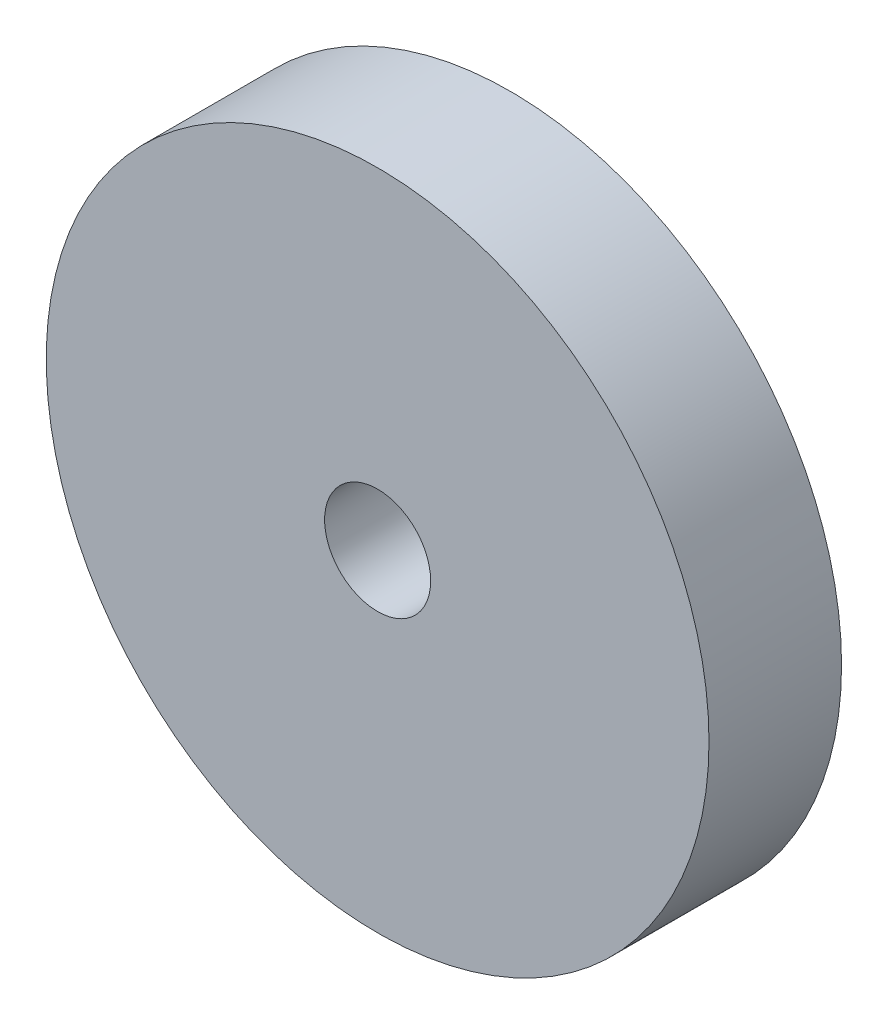
ISO-10303-21;
HEADER;
FILE_DESCRIPTION(('STEP AP214'),'2;1');
FILE_NAME('part.step','',(''),(''),'','','');
FILE_SCHEMA(('AUTOMOTIVE_DESIGN { 1 0 10303 214 1 1 1 1 }'));
ENDSEC;
DATA;
#1=APPLICATION_CONTEXT('core data for automotive mechanical design processes');
#2=APPLICATION_PROTOCOL_DEFINITION('international standard','automotive_design',2000,#1);
#3=PRODUCT_CONTEXT('',#1,'mechanical');
#4=PRODUCT('Part','Part','',(#3));
#5=PRODUCT_RELATED_PRODUCT_CATEGORY('part','',(#4));
#6=PRODUCT_DEFINITION_FORMATION('','',#4);
#7=PRODUCT_DEFINITION_CONTEXT('part definition',#1,'design');
#8=PRODUCT_DEFINITION('design','',#6,#7);
#9=PRODUCT_DEFINITION_SHAPE('','',#8);
#10=(LENGTH_UNIT() NAMED_UNIT(*) SI_UNIT(.MILLI.,.METRE.));
#11=(NAMED_UNIT(*) PLANE_ANGLE_UNIT() SI_UNIT($,.RADIAN.));
#12=(NAMED_UNIT(*) SI_UNIT($,.STERADIAN.) SOLID_ANGLE_UNIT());
#13=UNCERTAINTY_MEASURE_WITH_UNIT(LENGTH_MEASURE(1.E-05),#10,'distance_accuracy_value','');
#14=(GEOMETRIC_REPRESENTATION_CONTEXT(3) GLOBAL_UNCERTAINTY_ASSIGNED_CONTEXT((#13)) GLOBAL_UNIT_ASSIGNED_CONTEXT((#10,
#11,#12)) REPRESENTATION_CONTEXT('',''));
#15=CARTESIAN_POINT('',(0.,0.,0.));
#16=DIRECTION('',(0.,0.,1.));
#17=DIRECTION('',(1.,0.,0.));
#18=AXIS2_PLACEMENT_3D('',#15,#16,#17);
#19=CARTESIAN_POINT('',(0.,0.,5.));
#20=DIRECTION('',(0.,0.,1.));
#21=DIRECTION('',(1.,0.,0.));
#22=AXIS2_PLACEMENT_3D('',#19,#20,#21);
#23=PLANE('',#22);
#24=CARTESIAN_POINT('',(0.,0.,5.));
#25=DIRECTION('',(0.,0.,1.));
#26=DIRECTION('',(1.,0.,0.));
#27=AXIS2_PLACEMENT_3D('',#24,#25,#26);
#28=CIRCLE('',#27,25.);
#29=CARTESIAN_POINT('',(25.,0.,5.));
#30=VERTEX_POINT('',#29);
#31=EDGE_CURVE('E10',#30,#30,#28,.T.);
#32=ORIENTED_EDGE('',*,*,#31,.T.);
#33=EDGE_LOOP('',(#32));
#34=FACE_BOUND('',#33,.T.);
#35=CARTESIAN_POINT('',(0.,0.,5.));
#36=DIRECTION('',(0.,0.,1.));
#37=DIRECTION('',(1.,0.,0.));
#38=AXIS2_PLACEMENT_3D('',#35,#36,#37);
#39=CIRCLE('',#38,4.);
#40=CARTESIAN_POINT('',(4.,0.,5.));
#41=VERTEX_POINT('',#40);
#42=EDGE_CURVE('E57',#41,#41,#39,.T.);
#43=ORIENTED_EDGE('',*,*,#42,.F.);
#44=EDGE_LOOP('',(#43));
#45=FACE_BOUND('',#44,.T.);
#46=ADVANCED_FACE('F43',(#34,#45),#23,.T.);
#47=CARTESIAN_POINT('',(0.,0.,-5.));
#48=DIRECTION('',(0.,0.,1.));
#49=DIRECTION('',(1.,0.,0.));
#50=AXIS2_PLACEMENT_3D('',#47,#48,#49);
#51=PLANE('',#50);
#52=CARTESIAN_POINT('',(0.,0.,-5.));
#53=DIRECTION('',(0.,0.,1.));
#54=DIRECTION('',(1.,0.,0.));
#55=AXIS2_PLACEMENT_3D('',#52,#53,#54);
#56=CIRCLE('',#55,25.);
#57=CARTESIAN_POINT('',(25.,0.,-5.));
#58=VERTEX_POINT('',#57);
#59=EDGE_CURVE('E50',#58,#58,#56,.T.);
#60=ORIENTED_EDGE('',*,*,#59,.F.);
#61=EDGE_LOOP('',(#60));
#62=FACE_BOUND('',#61,.T.);
#63=CARTESIAN_POINT('',(0.,0.,-5.));
#64=DIRECTION('',(0.,0.,1.));
#65=DIRECTION('',(1.,0.,0.));
#66=AXIS2_PLACEMENT_3D('',#63,#64,#65);
#67=CIRCLE('',#66,4.);
#68=CARTESIAN_POINT('',(4.,0.,-5.));
#69=VERTEX_POINT('',#68);
#70=EDGE_CURVE('E59',#69,#69,#67,.T.);
#71=ORIENTED_EDGE('',*,*,#70,.T.);
#72=EDGE_LOOP('',(#71));
#73=FACE_BOUND('',#72,.T.);
#74=ADVANCED_FACE('F68',(#62,#73),#51,.F.);
#75=CARTESIAN_POINT('',(0.,0.,5.));
#76=DIRECTION('',(0.,0.,-1.));
#77=DIRECTION('',(-1.,0.,0.));
#78=AXIS2_PLACEMENT_3D('',#75,#76,#77);
#79=CYLINDRICAL_SURFACE('',#78,25.);
#80=ORIENTED_EDGE('',*,*,#31,.F.);
#81=EDGE_LOOP('',(#80));
#82=FACE_BOUND('',#81,.T.);
#83=ORIENTED_EDGE('',*,*,#59,.T.);
#84=EDGE_LOOP('',(#83));
#85=FACE_BOUND('',#84,.T.);
#86=ADVANCED_FACE('F44',(#82,#85),#79,.T.);
#87=CARTESIAN_POINT('',(0.,0.,5.));
#88=DIRECTION('',(0.,0.,-1.));
#89=DIRECTION('',(-1.,0.,0.));
#90=AXIS2_PLACEMENT_3D('',#87,#88,#89);
#91=CYLINDRICAL_SURFACE('',#90,4.);
#92=ORIENTED_EDGE('',*,*,#42,.T.);
#93=EDGE_LOOP('',(#92));
#94=FACE_BOUND('',#93,.T.);
#95=ORIENTED_EDGE('',*,*,#70,.F.);
#96=EDGE_LOOP('',(#95));
#97=FACE_BOUND('',#96,.T.);
#98=ADVANCED_FACE('F67',(#94,#97),#91,.F.);
#99=CLOSED_SHELL('',(#46,#74,#86,#98));
#100=MANIFOLD_SOLID_BREP('B2',#99);
#101=ADVANCED_BREP_SHAPE_REPRESENTATION('',(#18,#100),#14);
#102=SHAPE_DEFINITION_REPRESENTATION(#9,#101);
ENDSEC;
END-ISO-10303-21;
